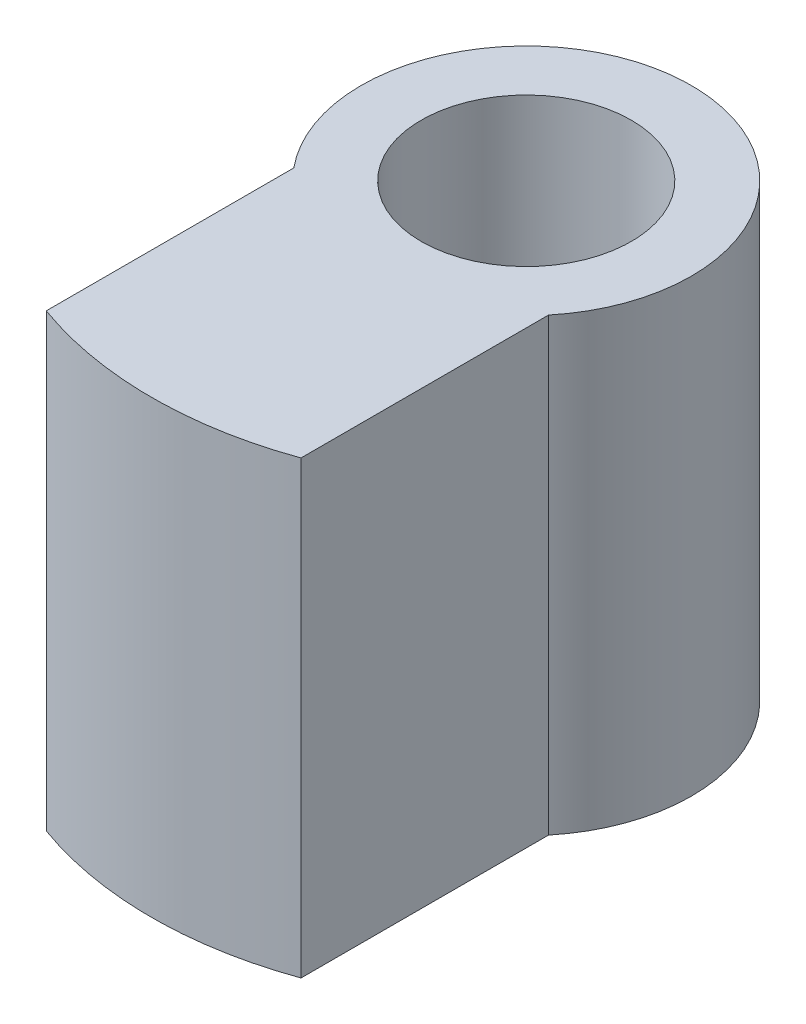
ISO-10303-21;
HEADER;
FILE_DESCRIPTION(('STEP AP214'),'2;1');
FILE_NAME('part.step','',(''),(''),'','','');
FILE_SCHEMA(('AUTOMOTIVE_DESIGN { 1 0 10303 214 1 1 1 1 }'));
ENDSEC;
DATA;
#1=APPLICATION_CONTEXT('core data for automotive mechanical design processes');
#2=APPLICATION_PROTOCOL_DEFINITION('international standard','automotive_design',2000,#1);
#3=PRODUCT_CONTEXT('',#1,'mechanical');
#4=PRODUCT('Part','Part','',(#3));
#5=PRODUCT_RELATED_PRODUCT_CATEGORY('part','',(#4));
#6=PRODUCT_DEFINITION_FORMATION('','',#4);
#7=PRODUCT_DEFINITION_CONTEXT('part definition',#1,'design');
#8=PRODUCT_DEFINITION('design','',#6,#7);
#9=PRODUCT_DEFINITION_SHAPE('','',#8);
#10=(LENGTH_UNIT() NAMED_UNIT(*) SI_UNIT(.MILLI.,.METRE.));
#11=(NAMED_UNIT(*) PLANE_ANGLE_UNIT() SI_UNIT($,.RADIAN.));
#12=(NAMED_UNIT(*) SI_UNIT($,.STERADIAN.) SOLID_ANGLE_UNIT());
#13=UNCERTAINTY_MEASURE_WITH_UNIT(LENGTH_MEASURE(1.E-05),#10,'distance_accuracy_value','');
#14=(GEOMETRIC_REPRESENTATION_CONTEXT(3) GLOBAL_UNCERTAINTY_ASSIGNED_CONTEXT((#13)) GLOBAL_UNIT_ASSIGNED_CONTEXT((#10,
#11,#12)) REPRESENTATION_CONTEXT('',''));
#15=CARTESIAN_POINT('',(0.,0.,0.));
#16=DIRECTION('',(0.,0.,1.));
#17=DIRECTION('',(1.,0.,0.));
#18=AXIS2_PLACEMENT_3D('',#15,#16,#17);
#19=CARTESIAN_POINT('',(0.,15.,0.));
#20=DIRECTION('',(0.,1.,0.));
#21=DIRECTION('',(0.,0.,1.));
#22=AXIS2_PLACEMENT_3D('',#19,#20,#21);
#23=PLANE('',#22);
#24=CARTESIAN_POINT('',(0.,15.,0.));
#25=DIRECTION('',(0.,1.,0.));
#26=DIRECTION('',(0.,0.,1.));
#27=AXIS2_PLACEMENT_3D('',#24,#25,#26);
#28=CIRCLE('',#27,5.5);
#29=CARTESIAN_POINT('',(4.24264068711928,15.,3.5));
#30=VERTEX_POINT('',#29);
#31=CARTESIAN_POINT('',(-4.24264068711928,15.,3.5));
#32=VERTEX_POINT('',#31);
#33=EDGE_CURVE('E98',#30,#32,#28,.T.);
#34=ORIENTED_EDGE('',*,*,#33,.T.);
#35=DIRECTION('',(0.,0.,1.));
#36=VECTOR('',#35,1.);
#37=CARTESIAN_POINT('',(-4.24264068711928,15.,3.5));
#38=LINE('',#37,#36);
#39=CARTESIAN_POINT('',(-4.24264068711929,15.,11.7437230076272));
#40=VERTEX_POINT('',#39);
#41=EDGE_CURVE('E93',#32,#40,#38,.T.);
#42=ORIENTED_EDGE('',*,*,#41,.T.);
#43=CARTESIAN_POINT('',(0.,15.,0.));
#44=DIRECTION('',(0.,1.,0.));
#45=DIRECTION('',(0.,0.,1.));
#46=AXIS2_PLACEMENT_3D('',#43,#44,#45);
#47=CIRCLE('',#46,12.4865940143769);
#48=CARTESIAN_POINT('',(4.24264068711928,15.,11.7437230076272));
#49=VERTEX_POINT('',#48);
#50=EDGE_CURVE('E96',#40,#49,#47,.T.);
#51=ORIENTED_EDGE('',*,*,#50,.T.);
#52=DIRECTION('',(0.,0.,-1.));
#53=VECTOR('',#52,1.);
#54=CARTESIAN_POINT('',(4.24264068711928,15.,3.5));
#55=LINE('',#54,#53);
#56=EDGE_CURVE('E63',#49,#30,#55,.T.);
#57=ORIENTED_EDGE('',*,*,#56,.T.);
#58=EDGE_LOOP('',(#34,#42,#51,#57));
#59=FACE_BOUND('',#58,.T.);
#60=CARTESIAN_POINT('',(0.,15.,0.));
#61=DIRECTION('',(0.,1.,0.));
#62=DIRECTION('',(0.,0.,1.));
#63=AXIS2_PLACEMENT_3D('',#60,#61,#62);
#64=CIRCLE('',#63,3.5);
#65=CARTESIAN_POINT('',(0.,15.,3.5));
#66=VERTEX_POINT('',#65);
#67=EDGE_CURVE('E118',#66,#66,#64,.T.);
#68=ORIENTED_EDGE('',*,*,#67,.F.);
#69=EDGE_LOOP('',(#68));
#70=FACE_BOUND('',#69,.T.);
#71=ADVANCED_FACE('F45',(#59,#70),#23,.T.);
#72=CARTESIAN_POINT('',(0.,0.,0.));
#73=DIRECTION('',(0.,1.,0.));
#74=DIRECTION('',(0.,0.,1.));
#75=AXIS2_PLACEMENT_3D('',#72,#73,#74);
#76=PLANE('',#75);
#77=CARTESIAN_POINT('',(0.,0.,0.));
#78=DIRECTION('',(0.,1.,0.));
#79=DIRECTION('',(0.,0.,1.));
#80=AXIS2_PLACEMENT_3D('',#77,#78,#79);
#81=CIRCLE('',#80,5.5);
#82=CARTESIAN_POINT('',(4.24264068711928,0.,3.5));
#83=VERTEX_POINT('',#82);
#84=CARTESIAN_POINT('',(-4.24264068711928,0.,3.5));
#85=VERTEX_POINT('',#84);
#86=EDGE_CURVE('E114',#83,#85,#81,.T.);
#87=ORIENTED_EDGE('',*,*,#86,.F.);
#88=DIRECTION('',(0.,0.,-1.));
#89=VECTOR('',#88,1.);
#90=CARTESIAN_POINT('',(4.24264068711928,0.,3.5));
#91=LINE('',#90,#89);
#92=CARTESIAN_POINT('',(4.24264068711928,0.,11.7437230076272));
#93=VERTEX_POINT('',#92);
#94=EDGE_CURVE('E86',#93,#83,#91,.T.);
#95=ORIENTED_EDGE('',*,*,#94,.F.);
#96=CARTESIAN_POINT('',(0.,0.,0.));
#97=DIRECTION('',(0.,1.,0.));
#98=DIRECTION('',(0.,0.,1.));
#99=AXIS2_PLACEMENT_3D('',#96,#97,#98);
#100=CIRCLE('',#99,12.4865940143769);
#101=CARTESIAN_POINT('',(-4.24264068711929,0.,11.7437230076272));
#102=VERTEX_POINT('',#101);
#103=EDGE_CURVE('E80',#102,#93,#100,.T.);
#104=ORIENTED_EDGE('',*,*,#103,.F.);
#105=DIRECTION('',(0.,0.,1.));
#106=VECTOR('',#105,1.);
#107=CARTESIAN_POINT('',(-4.24264068711928,0.,3.5));
#108=LINE('',#107,#106);
#109=EDGE_CURVE('E103',#85,#102,#108,.T.);
#110=ORIENTED_EDGE('',*,*,#109,.F.);
#111=EDGE_LOOP('',(#87,#95,#104,#110));
#112=FACE_BOUND('',#111,.T.);
#113=CARTESIAN_POINT('',(0.,0.,0.));
#114=DIRECTION('',(0.,1.,0.));
#115=DIRECTION('',(0.,0.,1.));
#116=AXIS2_PLACEMENT_3D('',#113,#114,#115);
#117=CIRCLE('',#116,3.5);
#118=CARTESIAN_POINT('',(0.,0.,3.5));
#119=VERTEX_POINT('',#118);
#120=EDGE_CURVE('E136',#119,#119,#117,.T.);
#121=ORIENTED_EDGE('',*,*,#120,.T.);
#122=EDGE_LOOP('',(#121));
#123=FACE_BOUND('',#122,.T.);
#124=ADVANCED_FACE('F131',(#112,#123),#76,.F.);
#125=CARTESIAN_POINT('',(0.,15.,0.));
#126=DIRECTION('',(0.,-1.,0.));
#127=DIRECTION('',(0.,0.,-1.));
#128=AXIS2_PLACEMENT_3D('',#125,#126,#127);
#129=CYLINDRICAL_SURFACE('',#128,5.5);
#130=ORIENTED_EDGE('',*,*,#86,.T.);
#131=DIRECTION('',(0.,-1.,0.));
#132=VECTOR('',#131,1.);
#133=CARTESIAN_POINT('',(-4.24264068711928,15.,3.5));
#134=LINE('',#133,#132);
#135=EDGE_CURVE('E11',#32,#85,#134,.T.);
#136=ORIENTED_EDGE('',*,*,#135,.F.);
#137=ORIENTED_EDGE('',*,*,#33,.F.);
#138=DIRECTION('',(0.,-1.,0.));
#139=VECTOR('',#138,1.);
#140=CARTESIAN_POINT('',(4.24264068711928,15.,3.5));
#141=LINE('',#140,#139);
#142=EDGE_CURVE('E110',#30,#83,#141,.T.);
#143=ORIENTED_EDGE('',*,*,#142,.T.);
#144=EDGE_LOOP('',(#130,#136,#137,#143));
#145=FACE_BOUND('',#144,.T.);
#146=ADVANCED_FACE('F47',(#145),#129,.T.);
#147=CARTESIAN_POINT('',(-4.24264068711928,15.,3.5));
#148=DIRECTION('',(1.,0.,0.));
#149=DIRECTION('',(0.,0.,-1.));
#150=AXIS2_PLACEMENT_3D('',#147,#148,#149);
#151=PLANE('',#150);
#152=ORIENTED_EDGE('',*,*,#109,.T.);
#153=DIRECTION('',(0.,-1.,0.));
#154=VECTOR('',#153,1.);
#155=CARTESIAN_POINT('',(-4.24264068711929,15.,11.7437230076272));
#156=LINE('',#155,#154);
#157=EDGE_CURVE('E55',#40,#102,#156,.T.);
#158=ORIENTED_EDGE('',*,*,#157,.F.);
#159=ORIENTED_EDGE('',*,*,#41,.F.);
#160=ORIENTED_EDGE('',*,*,#135,.T.);
#161=EDGE_LOOP('',(#152,#158,#159,#160));
#162=FACE_BOUND('',#161,.T.);
#163=ADVANCED_FACE('F102',(#162),#151,.F.);
#164=CARTESIAN_POINT('',(0.,15.,0.));
#165=DIRECTION('',(0.,-1.,0.));
#166=DIRECTION('',(0.,0.,-1.));
#167=AXIS2_PLACEMENT_3D('',#164,#165,#166);
#168=CYLINDRICAL_SURFACE('',#167,12.4865940143769);
#169=ORIENTED_EDGE('',*,*,#103,.T.);
#170=DIRECTION('',(0.,-1.,0.));
#171=VECTOR('',#170,1.);
#172=CARTESIAN_POINT('',(4.24264068711928,15.,11.7437230076272));
#173=LINE('',#172,#171);
#174=EDGE_CURVE('E105',#49,#93,#173,.T.);
#175=ORIENTED_EDGE('',*,*,#174,.F.);
#176=ORIENTED_EDGE('',*,*,#50,.F.);
#177=ORIENTED_EDGE('',*,*,#157,.T.);
#178=EDGE_LOOP('',(#169,#175,#176,#177));
#179=FACE_BOUND('',#178,.T.);
#180=ADVANCED_FACE('F106',(#179),#168,.T.);
#181=CARTESIAN_POINT('',(4.24264068711928,15.,3.5));
#182=DIRECTION('',(-1.,0.,0.));
#183=DIRECTION('',(0.,0.,1.));
#184=AXIS2_PLACEMENT_3D('',#181,#182,#183);
#185=PLANE('',#184);
#186=ORIENTED_EDGE('',*,*,#94,.T.);
#187=ORIENTED_EDGE('',*,*,#142,.F.);
#188=ORIENTED_EDGE('',*,*,#56,.F.);
#189=ORIENTED_EDGE('',*,*,#174,.T.);
#190=EDGE_LOOP('',(#186,#187,#188,#189));
#191=FACE_BOUND('',#190,.T.);
#192=ADVANCED_FACE('F128',(#191),#185,.F.);
#193=CARTESIAN_POINT('',(0.,15.,0.));
#194=DIRECTION('',(0.,-1.,0.));
#195=DIRECTION('',(0.,0.,-1.));
#196=AXIS2_PLACEMENT_3D('',#193,#194,#195);
#197=CYLINDRICAL_SURFACE('',#196,3.5);
#198=ORIENTED_EDGE('',*,*,#67,.T.);
#199=EDGE_LOOP('',(#198));
#200=FACE_BOUND('',#199,.T.);
#201=ORIENTED_EDGE('',*,*,#120,.F.);
#202=EDGE_LOOP('',(#201));
#203=FACE_BOUND('',#202,.T.);
#204=ADVANCED_FACE('F144',(#200,#203),#197,.F.);
#205=CLOSED_SHELL('',(#71,#124,#146,#163,#180,#192,#204));
#206=MANIFOLD_SOLID_BREP('B2',#205);
#207=ADVANCED_BREP_SHAPE_REPRESENTATION('',(#18,#206),#14);
#208=SHAPE_DEFINITION_REPRESENTATION(#9,#207);
ENDSEC;
END-ISO-10303-21;
